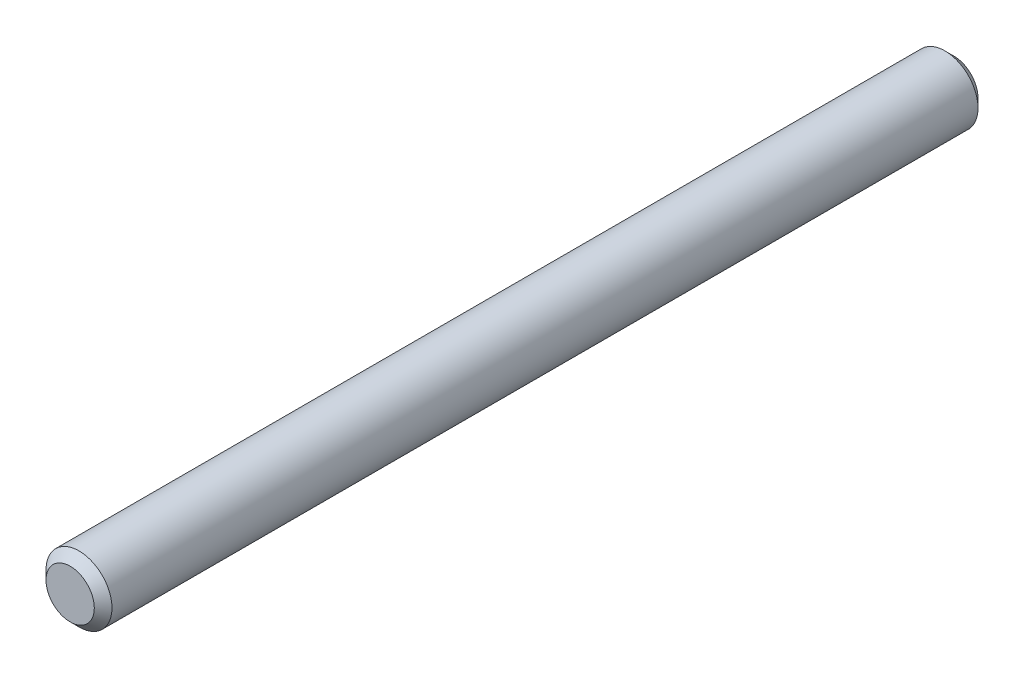
ISO-10303-21;
HEADER;
FILE_DESCRIPTION(('STEP AP214'),'2;1');
FILE_NAME('part.step','',(''),(''),'','','');
FILE_SCHEMA(('AUTOMOTIVE_DESIGN { 1 0 10303 214 1 1 1 1 }'));
ENDSEC;
DATA;
#1=APPLICATION_CONTEXT('core data for automotive mechanical design processes');
#2=APPLICATION_PROTOCOL_DEFINITION('international standard','automotive_design',2000,#1);
#3=PRODUCT_CONTEXT('',#1,'mechanical');
#4=PRODUCT('Part','Part','',(#3));
#5=PRODUCT_RELATED_PRODUCT_CATEGORY('part','',(#4));
#6=PRODUCT_DEFINITION_FORMATION('','',#4);
#7=PRODUCT_DEFINITION_CONTEXT('part definition',#1,'design');
#8=PRODUCT_DEFINITION('design','',#6,#7);
#9=PRODUCT_DEFINITION_SHAPE('','',#8);
#10=(LENGTH_UNIT() NAMED_UNIT(*) SI_UNIT(.MILLI.,.METRE.));
#11=(NAMED_UNIT(*) PLANE_ANGLE_UNIT() SI_UNIT($,.RADIAN.));
#12=(NAMED_UNIT(*) SI_UNIT($,.STERADIAN.) SOLID_ANGLE_UNIT());
#13=UNCERTAINTY_MEASURE_WITH_UNIT(LENGTH_MEASURE(1.E-05),#10,'distance_accuracy_value','');
#14=(GEOMETRIC_REPRESENTATION_CONTEXT(3) GLOBAL_UNCERTAINTY_ASSIGNED_CONTEXT((#13)) GLOBAL_UNIT_ASSIGNED_CONTEXT((#10,
#11,#12)) REPRESENTATION_CONTEXT('',''));
#15=CARTESIAN_POINT('',(0.,0.,0.));
#16=DIRECTION('',(0.,0.,1.));
#17=DIRECTION('',(1.,0.,0.));
#18=AXIS2_PLACEMENT_3D('',#15,#16,#17);
#19=CARTESIAN_POINT('',(0.,0.,-38.1));
#20=DIRECTION('',(0.,0.,1.));
#21=DIRECTION('',(1.,0.,0.));
#22=AXIS2_PLACEMENT_3D('',#19,#20,#21);
#23=CYLINDRICAL_SURFACE('',#22,1.4224);
#24=CARTESIAN_POINT('',(0.,0.,-37.719));
#25=DIRECTION('',(0.,0.,1.));
#26=DIRECTION('',(1.,0.,0.));
#27=AXIS2_PLACEMENT_3D('',#24,#25,#26);
#28=CIRCLE('',#27,1.4224);
#29=CARTESIAN_POINT('',(1.4224,0.,-37.719));
#30=VERTEX_POINT('',#29);
#31=EDGE_CURVE('E39',#30,#30,#28,.T.);
#32=CARTESIAN_POINT('',(0.,0.,-0.380999999999986));
#33=DIRECTION('',(0.,0.,1.));
#34=DIRECTION('',(1.,0.,0.));
#35=AXIS2_PLACEMENT_3D('',#32,#33,#34);
#36=CIRCLE('',#35,1.4224);
#37=CARTESIAN_POINT('',(1.4224,0.,-0.380999999999992));
#38=VERTEX_POINT('',#37);
#39=EDGE_CURVE('E43',#38,#38,#36,.F.);
#40=CARTESIAN_POINT('',(1.4224,0.,-37.719));
#41=CARTESIAN_POINT('',(1.4224,0.,-37.3300625));
#42=CARTESIAN_POINT('',(1.4224,0.,-36.941125));
#43=CARTESIAN_POINT('',(1.4224,0.,-36.16325));
#44=CARTESIAN_POINT('',(1.4224,0.,-35.7743125));
#45=CARTESIAN_POINT('',(1.4224,0.,-34.9964375));
#46=CARTESIAN_POINT('',(1.4224,0.,-34.6075));
#47=CARTESIAN_POINT('',(1.4224,0.,-33.829625));
#48=CARTESIAN_POINT('',(1.4224,0.,-33.4406875));
#49=CARTESIAN_POINT('',(1.4224,0.,-32.6628125));
#50=CARTESIAN_POINT('',(1.4224,0.,-32.273875));
#51=CARTESIAN_POINT('',(1.4224,0.,-31.496));
#52=CARTESIAN_POINT('',(1.4224,0.,-31.1070625));
#53=CARTESIAN_POINT('',(1.4224,0.,-30.3291875));
#54=CARTESIAN_POINT('',(1.4224,0.,-29.94025));
#55=CARTESIAN_POINT('',(1.4224,0.,-29.162375));
#56=CARTESIAN_POINT('',(1.4224,0.,-28.7734375));
#57=CARTESIAN_POINT('',(1.4224,0.,-27.9955625));
#58=CARTESIAN_POINT('',(1.4224,0.,-27.606625));
#59=CARTESIAN_POINT('',(1.4224,0.,-26.82875));
#60=CARTESIAN_POINT('',(1.4224,0.,-26.4398125));
#61=CARTESIAN_POINT('',(1.4224,0.,-25.6619375));
#62=CARTESIAN_POINT('',(1.4224,0.,-25.273));
#63=CARTESIAN_POINT('',(1.4224,0.,-24.495125));
#64=CARTESIAN_POINT('',(1.4224,0.,-24.1061875));
#65=CARTESIAN_POINT('',(1.4224,0.,-23.3283125));
#66=CARTESIAN_POINT('',(1.4224,0.,-22.939375));
#67=CARTESIAN_POINT('',(1.4224,0.,-22.1615));
#68=CARTESIAN_POINT('',(1.4224,0.,-21.7725625));
#69=CARTESIAN_POINT('',(1.4224,0.,-20.9946875));
#70=CARTESIAN_POINT('',(1.4224,0.,-20.60575));
#71=CARTESIAN_POINT('',(1.4224,0.,-19.827875));
#72=CARTESIAN_POINT('',(1.4224,0.,-19.4389375));
#73=CARTESIAN_POINT('',(1.4224,0.,-18.6610625));
#74=CARTESIAN_POINT('',(1.4224,0.,-18.272125));
#75=CARTESIAN_POINT('',(1.4224,0.,-17.49425));
#76=CARTESIAN_POINT('',(1.4224,0.,-17.1053125));
#77=CARTESIAN_POINT('',(1.4224,0.,-16.3274375));
#78=CARTESIAN_POINT('',(1.4224,0.,-15.9385));
#79=CARTESIAN_POINT('',(1.4224,0.,-15.160625));
#80=CARTESIAN_POINT('',(1.4224,0.,-14.7716875));
#81=CARTESIAN_POINT('',(1.4224,0.,-13.9938125));
#82=CARTESIAN_POINT('',(1.4224,0.,-13.604875));
#83=CARTESIAN_POINT('',(1.4224,0.,-12.827));
#84=CARTESIAN_POINT('',(1.4224,0.,-12.4380625));
#85=CARTESIAN_POINT('',(1.4224,0.,-11.6601875));
#86=CARTESIAN_POINT('',(1.4224,0.,-11.27125));
#87=CARTESIAN_POINT('',(1.4224,0.,-10.493375));
#88=CARTESIAN_POINT('',(1.4224,0.,-10.1044375));
#89=CARTESIAN_POINT('',(1.4224,0.,-9.32656249999999));
#90=CARTESIAN_POINT('',(1.4224,0.,-8.93762499999999));
#91=CARTESIAN_POINT('',(1.4224,0.,-8.15974999999999));
#92=CARTESIAN_POINT('',(1.4224,0.,-7.77081249999999));
#93=CARTESIAN_POINT('',(1.4224,0.,-6.99293749999999));
#94=CARTESIAN_POINT('',(1.4224,0.,-6.60399999999999));
#95=CARTESIAN_POINT('',(1.4224,0.,-5.82612499999999));
#96=CARTESIAN_POINT('',(1.4224,0.,-5.43718749999999));
#97=CARTESIAN_POINT('',(1.4224,0.,-4.65931249999999));
#98=CARTESIAN_POINT('',(1.4224,0.,-4.27037499999999));
#99=CARTESIAN_POINT('',(1.4224,0.,-3.49249999999999));
#100=CARTESIAN_POINT('',(1.4224,0.,-3.10356249999999));
#101=CARTESIAN_POINT('',(1.4224,0.,-2.32568749999999));
#102=CARTESIAN_POINT('',(1.4224,0.,-1.93674999999999));
#103=CARTESIAN_POINT('',(1.4224,0.,-1.15887499999999));
#104=CARTESIAN_POINT('',(1.4224,0.,-0.769937499999993));
#105=CARTESIAN_POINT('',(1.4224,0.,-0.380999999999992));
#106=B_SPLINE_CURVE_WITH_KNOTS('',3,(#40,#41,#42,#43,#44,#45,#46,#47,#48,#49,#50,#51,#52,#53,
#54,#55,#56,#57,#58,#59,#60,#61,#62,#63,#64,#65,#66,#67,#68,#69,#70,#71,#72,#73,#74,#75,#76,#77,
#78,#79,#80,#81,#82,#83,#84,#85,#86,#87,#88,#89,#90,#91,#92,#93,#94,#95,#96,#97,#98,#99,#100,
#101,#102,#103,#104,#105),.UNSPECIFIED.,.F.,.F.,(4,2,2,2,2,2,2,2,2,2,2,2,2,2,2,2,2,2,2,2,2,2,2,
2,2,2,2,2,2,2,2,2,4),(0.,1.1668125,2.33362500000001,3.5004375,4.66725,5.83406250000001,
7.00087500000001,8.16768750000001,9.33450000000001,10.5013125,11.668125,12.8349375,14.00175,
15.1685625,16.335375,17.5021875,18.669,19.8358125,21.002625,22.1694375,23.33625,24.5030625,
25.669875,26.8366875,28.0035,29.1703125,30.337125,31.5039375,32.67075,33.8375625,35.004375,
36.1711875,37.338),.UNSPECIFIED.);
#107=EDGE_CURVE('BSEAM29',#30,#38,#106,.T.);
#108=ORIENTED_EDGE('',*,*,#31,.T.);
#109=ORIENTED_EDGE('',*,*,#39,.T.);
#110=ORIENTED_EDGE('',*,*,#107,.T.);
#111=ORIENTED_EDGE('',*,*,#107,.F.);
#112=EDGE_LOOP('',(#108,#110,#109,#111));
#113=FACE_BOUND('',#112,.T.);
#114=ADVANCED_FACE('F29',(#113),#23,.T.);
#115=CARTESIAN_POINT('',(0.,0.,-38.1));
#116=DIRECTION('',(0.,0.,1.));
#117=DIRECTION('',(1.,0.,0.));
#118=AXIS2_PLACEMENT_3D('',#115,#116,#117);
#119=PLANE('',#118);
#120=CARTESIAN_POINT('',(0.,0.,-38.1));
#121=DIRECTION('',(0.,0.,1.));
#122=DIRECTION('',(1.,0.,0.));
#123=AXIS2_PLACEMENT_3D('',#120,#121,#122);
#124=CIRCLE('',#123,1.0414);
#125=CARTESIAN_POINT('',(1.0414,0.,-38.1));
#126=VERTEX_POINT('',#125);
#127=EDGE_CURVE('E35',#126,#126,#124,.F.);
#128=ORIENTED_EDGE('',*,*,#127,.T.);
#129=EDGE_LOOP('',(#128));
#130=FACE_BOUND('',#129,.T.);
#131=ADVANCED_FACE('F62',(#130),#119,.F.);
#132=CARTESIAN_POINT('',(0.,0.,0.));
#133=DIRECTION('',(0.,0.,1.));
#134=DIRECTION('',(1.,0.,0.));
#135=AXIS2_PLACEMENT_3D('',#132,#133,#134);
#136=PLANE('',#135);
#137=CARTESIAN_POINT('',(0.,0.,0.));
#138=DIRECTION('',(0.,0.,1.));
#139=DIRECTION('',(1.,0.,0.));
#140=AXIS2_PLACEMENT_3D('',#137,#138,#139);
#141=CIRCLE('',#140,1.0414);
#142=CARTESIAN_POINT('',(1.0414,0.,0.));
#143=VERTEX_POINT('',#142);
#144=EDGE_CURVE('E10',#143,#143,#141,.T.);
#145=ORIENTED_EDGE('',*,*,#144,.T.);
#146=EDGE_LOOP('',(#145));
#147=FACE_BOUND('',#146,.T.);
#148=ADVANCED_FACE('F58',(#147),#136,.T.);
#149=CARTESIAN_POINT('',(0.,0.,-37.719));
#150=DIRECTION('',(0.,0.,1.));
#151=DIRECTION('',(1.,0.,0.));
#152=AXIS2_PLACEMENT_3D('',#149,#150,#151);
#153=CONICAL_SURFACE('',#152,1.4224,0.785398163397452);
#154=ORIENTED_EDGE('',*,*,#127,.F.);
#155=EDGE_LOOP('',(#154));
#156=FACE_BOUND('',#155,.T.);
#157=ORIENTED_EDGE('',*,*,#31,.F.);
#158=EDGE_LOOP('',(#157));
#159=FACE_BOUND('',#158,.T.);
#160=ADVANCED_FACE('F53',(#156,#159),#153,.T.);
#161=CARTESIAN_POINT('',(0.,0.,0.));
#162=DIRECTION('',(0.,0.,-1.));
#163=DIRECTION('',(-1.,0.,0.));
#164=AXIS2_PLACEMENT_3D('',#161,#162,#163);
#165=CONICAL_SURFACE('',#164,1.0414,0.785398163397461);
#166=ORIENTED_EDGE('',*,*,#39,.F.);
#167=EDGE_LOOP('',(#166));
#168=FACE_BOUND('',#167,.T.);
#169=ORIENTED_EDGE('',*,*,#144,.F.);
#170=EDGE_LOOP('',(#169));
#171=FACE_BOUND('',#170,.T.);
#172=ADVANCED_FACE('F50',(#168,#171),#165,.T.);
#173=CLOSED_SHELL('',(#114,#131,#148,#160,#172));
#174=MANIFOLD_SOLID_BREP('B2',#173);
#175=ADVANCED_BREP_SHAPE_REPRESENTATION('',(#18,#174),#14);
#176=SHAPE_DEFINITION_REPRESENTATION(#9,#175);
ENDSEC;
END-ISO-10303-21;
